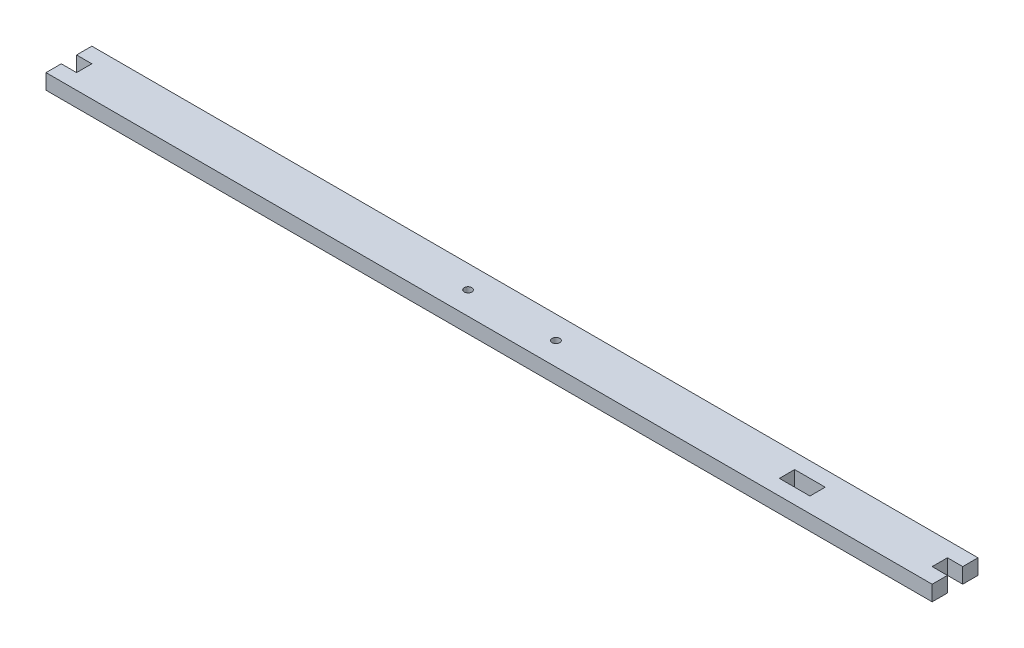
ISO-10303-21;
HEADER;
FILE_DESCRIPTION(('STEP AP214'),'2;1');
FILE_NAME('part.step','',(''),(''),'','','');
FILE_SCHEMA(('AUTOMOTIVE_DESIGN { 1 0 10303 214 1 1 1 1 }'));
ENDSEC;
DATA;
#1=APPLICATION_CONTEXT('core data for automotive mechanical design processes');
#2=APPLICATION_PROTOCOL_DEFINITION('international standard','automotive_design',2000,#1);
#3=PRODUCT_CONTEXT('',#1,'mechanical');
#4=PRODUCT('Part','Part','',(#3));
#5=PRODUCT_RELATED_PRODUCT_CATEGORY('part','',(#4));
#6=PRODUCT_DEFINITION_FORMATION('','',#4);
#7=PRODUCT_DEFINITION_CONTEXT('part definition',#1,'design');
#8=PRODUCT_DEFINITION('design','',#6,#7);
#9=PRODUCT_DEFINITION_SHAPE('','',#8);
#10=(LENGTH_UNIT() NAMED_UNIT(*) SI_UNIT(.MILLI.,.METRE.));
#11=(NAMED_UNIT(*) PLANE_ANGLE_UNIT() SI_UNIT($,.RADIAN.));
#12=(NAMED_UNIT(*) SI_UNIT($,.STERADIAN.) SOLID_ANGLE_UNIT());
#13=UNCERTAINTY_MEASURE_WITH_UNIT(LENGTH_MEASURE(1.E-05),#10,'distance_accuracy_value','');
#14=(GEOMETRIC_REPRESENTATION_CONTEXT(3) GLOBAL_UNCERTAINTY_ASSIGNED_CONTEXT((#13)) GLOBAL_UNIT_ASSIGNED_CONTEXT((#10,
#11,#12)) REPRESENTATION_CONTEXT('',''));
#15=CARTESIAN_POINT('',(0.,0.,0.));
#16=DIRECTION('',(0.,0.,1.));
#17=DIRECTION('',(1.,0.,0.));
#18=AXIS2_PLACEMENT_3D('',#15,#16,#17);
#19=CARTESIAN_POINT('',(0.,6.35,-12.7));
#20=DIRECTION('',(0.,0.,-1.));
#21=DIRECTION('',(-1.,0.,0.));
#22=AXIS2_PLACEMENT_3D('',#19,#20,#21);
#23=PLANE('',#22);
#24=DIRECTION('',(1.,0.,0.));
#25=VECTOR('',#24,1.);
#26=CARTESIAN_POINT('',(0.,0.,-12.7));
#27=LINE('',#26,#25);
#28=CARTESIAN_POINT('',(292.1,0.,-12.7));
#29=VERTEX_POINT('',#28);
#30=CARTESIAN_POINT('',(304.8,0.,-12.7));
#31=VERTEX_POINT('',#30);
#32=EDGE_CURVE('E221',#29,#31,#27,.T.);
#33=ORIENTED_EDGE('',*,*,#32,.T.);
#34=DIRECTION('',(0.,-1.,0.));
#35=VECTOR('',#34,1.);
#36=CARTESIAN_POINT('',(304.8,6.35,-12.7));
#37=LINE('',#36,#35);
#38=CARTESIAN_POINT('',(304.8,6.35,-12.7));
#39=VERTEX_POINT('',#38);
#40=EDGE_CURVE('E11',#39,#31,#37,.T.);
#41=ORIENTED_EDGE('',*,*,#40,.F.);
#42=DIRECTION('',(1.,0.,0.));
#43=VECTOR('',#42,1.);
#44=CARTESIAN_POINT('',(0.,6.35,-12.7));
#45=LINE('',#44,#43);
#46=CARTESIAN_POINT('',(292.1,6.35,-12.7));
#47=VERTEX_POINT('',#46);
#48=EDGE_CURVE('E163',#47,#39,#45,.T.);
#49=ORIENTED_EDGE('',*,*,#48,.F.);
#50=DIRECTION('',(0.,-1.,0.));
#51=VECTOR('',#50,1.);
#52=CARTESIAN_POINT('',(292.1,6.35,-12.7));
#53=LINE('',#52,#51);
#54=EDGE_CURVE('E54',#47,#29,#53,.T.);
#55=ORIENTED_EDGE('',*,*,#54,.T.);
#56=EDGE_LOOP('',(#33,#41,#49,#55));
#57=FACE_BOUND('',#56,.T.);
#58=ADVANCED_FACE('F35',(#57),#23,.F.);
#59=CARTESIAN_POINT('',(304.8,6.35,0.));
#60=DIRECTION('',(1.,0.,0.));
#61=DIRECTION('',(0.,0.,-1.));
#62=AXIS2_PLACEMENT_3D('',#59,#60,#61);
#63=PLANE('',#62);
#64=DIRECTION('',(0.,0.,1.));
#65=VECTOR('',#64,1.);
#66=CARTESIAN_POINT('',(304.8,0.,0.));
#67=LINE('',#66,#65);
#68=CARTESIAN_POINT('',(304.8,0.,-6.35000000000001));
#69=VERTEX_POINT('',#68);
#70=EDGE_CURVE('E169',#31,#69,#67,.T.);
#71=ORIENTED_EDGE('',*,*,#70,.T.);
#72=DIRECTION('',(0.,-1.,0.));
#73=VECTOR('',#72,1.);
#74=CARTESIAN_POINT('',(304.8,6.35,-6.35000000000001));
#75=LINE('',#74,#73);
#76=CARTESIAN_POINT('',(304.8,6.35,-6.35000000000001));
#77=VERTEX_POINT('',#76);
#78=EDGE_CURVE('E45',#77,#69,#75,.T.);
#79=ORIENTED_EDGE('',*,*,#78,.F.);
#80=DIRECTION('',(0.,0.,1.));
#81=VECTOR('',#80,1.);
#82=CARTESIAN_POINT('',(304.8,6.35,0.));
#83=LINE('',#82,#81);
#84=EDGE_CURVE('E157',#39,#77,#83,.T.);
#85=ORIENTED_EDGE('',*,*,#84,.F.);
#86=ORIENTED_EDGE('',*,*,#40,.T.);
#87=EDGE_LOOP('',(#71,#79,#85,#86));
#88=FACE_BOUND('',#87,.T.);
#89=ADVANCED_FACE('F168',(#88),#63,.F.);
#90=CARTESIAN_POINT('',(0.,6.35,-6.34999999999999));
#91=DIRECTION('',(0.,0.,-1.));
#92=DIRECTION('',(-1.,0.,0.));
#93=AXIS2_PLACEMENT_3D('',#90,#91,#92);
#94=PLANE('',#93);
#95=DIRECTION('',(1.,0.,0.));
#96=VECTOR('',#95,1.);
#97=CARTESIAN_POINT('',(0.,0.,-6.34999999999999));
#98=LINE('',#97,#96);
#99=CARTESIAN_POINT('',(292.1,0.,-6.35000000000001));
#100=VERTEX_POINT('',#99);
#101=EDGE_CURVE('E224',#100,#69,#98,.T.);
#102=ORIENTED_EDGE('',*,*,#101,.F.);
#103=DIRECTION('',(0.,-1.,0.));
#104=VECTOR('',#103,1.);
#105=CARTESIAN_POINT('',(292.1,6.35,-6.35000000000001));
#106=LINE('',#105,#104);
#107=CARTESIAN_POINT('',(292.1,6.35,-6.35000000000001));
#108=VERTEX_POINT('',#107);
#109=EDGE_CURVE('E104',#108,#100,#106,.T.);
#110=ORIENTED_EDGE('',*,*,#109,.F.);
#111=DIRECTION('',(1.,0.,0.));
#112=VECTOR('',#111,1.);
#113=CARTESIAN_POINT('',(0.,6.35,-6.34999999999999));
#114=LINE('',#113,#112);
#115=EDGE_CURVE('E162',#108,#77,#114,.T.);
#116=ORIENTED_EDGE('',*,*,#115,.T.);
#117=ORIENTED_EDGE('',*,*,#78,.T.);
#118=EDGE_LOOP('',(#102,#110,#116,#117));
#119=FACE_BOUND('',#118,.T.);
#120=ADVANCED_FACE('F173',(#119),#94,.T.);
#121=CARTESIAN_POINT('',(0.,6.35,0.));
#122=DIRECTION('',(0.,0.,-1.));
#123=DIRECTION('',(-1.,0.,0.));
#124=AXIS2_PLACEMENT_3D('',#121,#122,#123);
#125=PLANE('',#124);
#126=DIRECTION('',(1.,0.,0.));
#127=VECTOR('',#126,1.);
#128=CARTESIAN_POINT('',(0.,0.,0.));
#129=LINE('',#128,#127);
#130=CARTESIAN_POINT('',(-6.35,0.,0.));
#131=VERTEX_POINT('',#130);
#132=CARTESIAN_POINT('',(361.95,0.,0.));
#133=VERTEX_POINT('',#132);
#134=EDGE_CURVE('E186',#131,#133,#129,.T.);
#135=ORIENTED_EDGE('',*,*,#134,.T.);
#136=DIRECTION('',(0.,-1.,0.));
#137=VECTOR('',#136,1.);
#138=CARTESIAN_POINT('',(361.95,6.35,0.));
#139=LINE('',#138,#137);
#140=CARTESIAN_POINT('',(361.95,6.35,0.));
#141=VERTEX_POINT('',#140);
#142=EDGE_CURVE('E39',#141,#133,#139,.T.);
#143=ORIENTED_EDGE('',*,*,#142,.F.);
#144=DIRECTION('',(1.,0.,0.));
#145=VECTOR('',#144,1.);
#146=CARTESIAN_POINT('',(0.,6.35,0.));
#147=LINE('',#146,#145);
#148=CARTESIAN_POINT('',(-6.35,6.35,0.));
#149=VERTEX_POINT('',#148);
#150=EDGE_CURVE('E319',#149,#141,#147,.T.);
#151=ORIENTED_EDGE('',*,*,#150,.F.);
#152=DIRECTION('',(0.,-1.,0.));
#153=VECTOR('',#152,1.);
#154=CARTESIAN_POINT('',(-6.35,6.35,0.));
#155=LINE('',#154,#153);
#156=EDGE_CURVE('E176',#149,#131,#155,.T.);
#157=ORIENTED_EDGE('',*,*,#156,.T.);
#158=EDGE_LOOP('',(#135,#143,#151,#157));
#159=FACE_BOUND('',#158,.T.);
#160=ADVANCED_FACE('F260',(#159),#125,.F.);
#161=CARTESIAN_POINT('',(361.95,6.35,0.));
#162=DIRECTION('',(-1.,0.,0.));
#163=DIRECTION('',(0.,0.,1.));
#164=AXIS2_PLACEMENT_3D('',#161,#162,#163);
#165=PLANE('',#164);
#166=DIRECTION('',(0.,0.,-1.));
#167=VECTOR('',#166,1.);
#168=CARTESIAN_POINT('',(361.95,0.,0.));
#169=LINE('',#168,#167);
#170=CARTESIAN_POINT('',(361.95,0.,-6.35000000000001));
#171=VERTEX_POINT('',#170);
#172=EDGE_CURVE('E189',#133,#171,#169,.T.);
#173=ORIENTED_EDGE('',*,*,#172,.T.);
#174=DIRECTION('',(0.,-1.,0.));
#175=VECTOR('',#174,1.);
#176=CARTESIAN_POINT('',(361.95,6.35,-6.35000000000001));
#177=LINE('',#176,#175);
#178=CARTESIAN_POINT('',(361.95,6.35,-6.35000000000001));
#179=VERTEX_POINT('',#178);
#180=EDGE_CURVE('E251',#179,#171,#177,.T.);
#181=ORIENTED_EDGE('',*,*,#180,.F.);
#182=DIRECTION('',(0.,0.,-1.));
#183=VECTOR('',#182,1.);
#184=CARTESIAN_POINT('',(361.95,6.35,0.));
#185=LINE('',#184,#183);
#186=EDGE_CURVE('E117',#141,#179,#185,.T.);
#187=ORIENTED_EDGE('',*,*,#186,.F.);
#188=ORIENTED_EDGE('',*,*,#142,.T.);
#189=EDGE_LOOP('',(#173,#181,#187,#188));
#190=FACE_BOUND('',#189,.T.);
#191=ADVANCED_FACE('F256',(#190),#165,.F.);
#192=CARTESIAN_POINT('',(0.,6.35,-6.35000000000006));
#193=DIRECTION('',(0.,0.,-1.));
#194=DIRECTION('',(-1.,0.,0.));
#195=AXIS2_PLACEMENT_3D('',#192,#193,#194);
#196=PLANE('',#195);
#197=DIRECTION('',(1.,0.,0.));
#198=VECTOR('',#197,1.);
#199=CARTESIAN_POINT('',(0.,0.,-6.35000000000006));
#200=LINE('',#199,#198);
#201=CARTESIAN_POINT('',(355.6,0.,-6.35000000000001));
#202=VERTEX_POINT('',#201);
#203=EDGE_CURVE('E192',#202,#171,#200,.T.);
#204=ORIENTED_EDGE('',*,*,#203,.F.);
#205=DIRECTION('',(0.,-1.,0.));
#206=VECTOR('',#205,1.);
#207=CARTESIAN_POINT('',(355.6,6.35,-6.35000000000001));
#208=LINE('',#207,#206);
#209=CARTESIAN_POINT('',(355.6,6.35,-6.35000000000001));
#210=VERTEX_POINT('',#209);
#211=EDGE_CURVE('E250',#210,#202,#208,.T.);
#212=ORIENTED_EDGE('',*,*,#211,.F.);
#213=DIRECTION('',(1.,0.,0.));
#214=VECTOR('',#213,1.);
#215=CARTESIAN_POINT('',(0.,6.35,-6.35000000000006));
#216=LINE('',#215,#214);
#217=EDGE_CURVE('E315',#210,#179,#216,.T.);
#218=ORIENTED_EDGE('',*,*,#217,.T.);
#219=ORIENTED_EDGE('',*,*,#180,.T.);
#220=EDGE_LOOP('',(#204,#212,#218,#219));
#221=FACE_BOUND('',#220,.T.);
#222=ADVANCED_FACE('F314',(#221),#196,.T.);
#223=CARTESIAN_POINT('',(355.6,6.35,0.));
#224=DIRECTION('',(-1.,0.,0.));
#225=DIRECTION('',(0.,0.,1.));
#226=AXIS2_PLACEMENT_3D('',#223,#224,#225);
#227=PLANE('',#226);
#228=DIRECTION('',(0.,0.,-1.));
#229=VECTOR('',#228,1.);
#230=CARTESIAN_POINT('',(355.6,0.,0.));
#231=LINE('',#230,#229);
#232=CARTESIAN_POINT('',(355.6,0.,-12.7));
#233=VERTEX_POINT('',#232);
#234=EDGE_CURVE('E195',#202,#233,#231,.T.);
#235=ORIENTED_EDGE('',*,*,#234,.T.);
#236=DIRECTION('',(0.,-1.,0.));
#237=VECTOR('',#236,1.);
#238=CARTESIAN_POINT('',(355.6,6.35,-12.7));
#239=LINE('',#238,#237);
#240=CARTESIAN_POINT('',(355.6,6.35,-12.7));
#241=VERTEX_POINT('',#240);
#242=EDGE_CURVE('E247',#241,#233,#239,.T.);
#243=ORIENTED_EDGE('',*,*,#242,.F.);
#244=DIRECTION('',(0.,0.,-1.));
#245=VECTOR('',#244,1.);
#246=CARTESIAN_POINT('',(355.6,6.35,0.));
#247=LINE('',#246,#245);
#248=EDGE_CURVE('E312',#210,#241,#247,.T.);
#249=ORIENTED_EDGE('',*,*,#248,.F.);
#250=ORIENTED_EDGE('',*,*,#211,.T.);
#251=EDGE_LOOP('',(#235,#243,#249,#250));
#252=FACE_BOUND('',#251,.T.);
#253=ADVANCED_FACE('F311',(#252),#227,.F.);
#254=CARTESIAN_POINT('',(0.,6.35,-12.7));
#255=DIRECTION('',(0.,0.,-1.));
#256=DIRECTION('',(-1.,0.,0.));
#257=AXIS2_PLACEMENT_3D('',#254,#255,#256);
#258=PLANE('',#257);
#259=DIRECTION('',(1.,0.,0.));
#260=VECTOR('',#259,1.);
#261=CARTESIAN_POINT('',(0.,0.,-12.7));
#262=LINE('',#261,#260);
#263=CARTESIAN_POINT('',(361.95,0.,-12.7));
#264=VERTEX_POINT('',#263);
#265=EDGE_CURVE('E197',#233,#264,#262,.T.);
#266=ORIENTED_EDGE('',*,*,#265,.T.);
#267=DIRECTION('',(0.,-1.,0.));
#268=VECTOR('',#267,1.);
#269=CARTESIAN_POINT('',(361.95,6.35,-12.7));
#270=LINE('',#269,#268);
#271=CARTESIAN_POINT('',(361.95,6.35,-12.7));
#272=VERTEX_POINT('',#271);
#273=EDGE_CURVE('E245',#272,#264,#270,.T.);
#274=ORIENTED_EDGE('',*,*,#273,.F.);
#275=DIRECTION('',(1.,0.,0.));
#276=VECTOR('',#275,1.);
#277=CARTESIAN_POINT('',(0.,6.35,-12.7));
#278=LINE('',#277,#276);
#279=EDGE_CURVE('E308',#241,#272,#278,.T.);
#280=ORIENTED_EDGE('',*,*,#279,.F.);
#281=ORIENTED_EDGE('',*,*,#242,.T.);
#282=EDGE_LOOP('',(#266,#274,#280,#281));
#283=FACE_BOUND('',#282,.T.);
#284=ADVANCED_FACE('F305',(#283),#258,.F.);
#285=CARTESIAN_POINT('',(361.95,6.35,0.));
#286=DIRECTION('',(1.,0.,0.));
#287=DIRECTION('',(0.,0.,-1.));
#288=AXIS2_PLACEMENT_3D('',#285,#286,#287);
#289=PLANE('',#288);
#290=DIRECTION('',(0.,0.,1.));
#291=VECTOR('',#290,1.);
#292=CARTESIAN_POINT('',(361.95,0.,0.));
#293=LINE('',#292,#291);
#294=CARTESIAN_POINT('',(361.95,0.,-19.05));
#295=VERTEX_POINT('',#294);
#296=EDGE_CURVE('E200',#295,#264,#293,.T.);
#297=ORIENTED_EDGE('',*,*,#296,.F.);
#298=DIRECTION('',(0.,-1.,0.));
#299=VECTOR('',#298,1.);
#300=CARTESIAN_POINT('',(361.95,6.35,-19.05));
#301=LINE('',#300,#299);
#302=CARTESIAN_POINT('',(361.95,6.35,-19.05));
#303=VERTEX_POINT('',#302);
#304=EDGE_CURVE('E243',#303,#295,#301,.T.);
#305=ORIENTED_EDGE('',*,*,#304,.F.);
#306=DIRECTION('',(0.,0.,1.));
#307=VECTOR('',#306,1.);
#308=CARTESIAN_POINT('',(361.95,6.35,0.));
#309=LINE('',#308,#307);
#310=EDGE_CURVE('E324',#303,#272,#309,.T.);
#311=ORIENTED_EDGE('',*,*,#310,.T.);
#312=ORIENTED_EDGE('',*,*,#273,.T.);
#313=EDGE_LOOP('',(#297,#305,#311,#312));
#314=FACE_BOUND('',#313,.T.);
#315=ADVANCED_FACE('F300',(#314),#289,.T.);
#316=CARTESIAN_POINT('',(0.,6.35,-19.05));
#317=DIRECTION('',(0.,0.,-1.));
#318=DIRECTION('',(-1.,0.,0.));
#319=AXIS2_PLACEMENT_3D('',#316,#317,#318);
#320=PLANE('',#319);
#321=DIRECTION('',(1.,0.,0.));
#322=VECTOR('',#321,1.);
#323=CARTESIAN_POINT('',(0.,0.,-19.05));
#324=LINE('',#323,#322);
#325=CARTESIAN_POINT('',(-6.35,0.,-19.05));
#326=VERTEX_POINT('',#325);
#327=EDGE_CURVE('E203',#326,#295,#324,.T.);
#328=ORIENTED_EDGE('',*,*,#327,.F.);
#329=DIRECTION('',(0.,-1.,0.));
#330=VECTOR('',#329,1.);
#331=CARTESIAN_POINT('',(-6.35,6.35,-19.05));
#332=LINE('',#331,#330);
#333=CARTESIAN_POINT('',(-6.35,6.35,-19.05));
#334=VERTEX_POINT('',#333);
#335=EDGE_CURVE('E241',#334,#326,#332,.T.);
#336=ORIENTED_EDGE('',*,*,#335,.F.);
#337=DIRECTION('',(1.,0.,0.));
#338=VECTOR('',#337,1.);
#339=CARTESIAN_POINT('',(0.,6.35,-19.05));
#340=LINE('',#339,#338);
#341=EDGE_CURVE('E296',#334,#303,#340,.T.);
#342=ORIENTED_EDGE('',*,*,#341,.T.);
#343=ORIENTED_EDGE('',*,*,#304,.T.);
#344=EDGE_LOOP('',(#328,#336,#342,#343));
#345=FACE_BOUND('',#344,.T.);
#346=ADVANCED_FACE('F291',(#345),#320,.T.);
#347=CARTESIAN_POINT('',(-6.34999999999999,6.35,0.));
#348=DIRECTION('',(1.,0.,0.));
#349=DIRECTION('',(0.,0.,-1.));
#350=AXIS2_PLACEMENT_3D('',#347,#348,#349);
#351=PLANE('',#350);
#352=DIRECTION('',(0.,0.,1.));
#353=VECTOR('',#352,1.);
#354=CARTESIAN_POINT('',(-6.34999999999999,0.,0.));
#355=LINE('',#354,#353);
#356=CARTESIAN_POINT('',(-6.35,0.,-12.7));
#357=VERTEX_POINT('',#356);
#358=EDGE_CURVE('E206',#326,#357,#355,.T.);
#359=ORIENTED_EDGE('',*,*,#358,.T.);
#360=DIRECTION('',(0.,-1.,0.));
#361=VECTOR('',#360,1.);
#362=CARTESIAN_POINT('',(-6.35,6.35,-12.7));
#363=LINE('',#362,#361);
#364=CARTESIAN_POINT('',(-6.35,6.35,-12.7));
#365=VERTEX_POINT('',#364);
#366=EDGE_CURVE('E239',#365,#357,#363,.T.);
#367=ORIENTED_EDGE('',*,*,#366,.F.);
#368=DIRECTION('',(0.,0.,1.));
#369=VECTOR('',#368,1.);
#370=CARTESIAN_POINT('',(-6.34999999999999,6.35,0.));
#371=LINE('',#370,#369);
#372=EDGE_CURVE('E327',#334,#365,#371,.T.);
#373=ORIENTED_EDGE('',*,*,#372,.F.);
#374=ORIENTED_EDGE('',*,*,#335,.T.);
#375=EDGE_LOOP('',(#359,#367,#373,#374));
#376=FACE_BOUND('',#375,.T.);
#377=ADVANCED_FACE('F334',(#376),#351,.F.);
#378=CARTESIAN_POINT('',(0.,6.35,-12.7));
#379=DIRECTION('',(0.,0.,1.));
#380=DIRECTION('',(1.,0.,0.));
#381=AXIS2_PLACEMENT_3D('',#378,#379,#380);
#382=PLANE('',#381);
#383=DIRECTION('',(-1.,0.,0.));
#384=VECTOR('',#383,1.);
#385=CARTESIAN_POINT('',(0.,0.,-12.7));
#386=LINE('',#385,#384);
#387=CARTESIAN_POINT('',(0.,0.,-12.7));
#388=VERTEX_POINT('',#387);
#389=EDGE_CURVE('E209',#388,#357,#386,.T.);
#390=ORIENTED_EDGE('',*,*,#389,.F.);
#391=DIRECTION('',(0.,-1.,0.));
#392=VECTOR('',#391,1.);
#393=CARTESIAN_POINT('',(0.,6.35,-12.7));
#394=LINE('',#393,#392);
#395=CARTESIAN_POINT('',(0.,6.35,-12.7));
#396=VERTEX_POINT('',#395);
#397=EDGE_CURVE('E237',#396,#388,#394,.T.);
#398=ORIENTED_EDGE('',*,*,#397,.F.);
#399=DIRECTION('',(-1.,0.,0.));
#400=VECTOR('',#399,1.);
#401=CARTESIAN_POINT('',(0.,6.35,-12.7));
#402=LINE('',#401,#400);
#403=EDGE_CURVE('E329',#396,#365,#402,.T.);
#404=ORIENTED_EDGE('',*,*,#403,.T.);
#405=ORIENTED_EDGE('',*,*,#366,.T.);
#406=EDGE_LOOP('',(#390,#398,#404,#405));
#407=FACE_BOUND('',#406,.T.);
#408=ADVANCED_FACE('F285',(#407),#382,.T.);
#409=CARTESIAN_POINT('',(0.,6.35,0.));
#410=DIRECTION('',(-1.,0.,0.));
#411=DIRECTION('',(0.,0.,1.));
#412=AXIS2_PLACEMENT_3D('',#409,#410,#411);
#413=PLANE('',#412);
#414=DIRECTION('',(0.,0.,-1.));
#415=VECTOR('',#414,1.);
#416=CARTESIAN_POINT('',(0.,0.,0.));
#417=LINE('',#416,#415);
#418=CARTESIAN_POINT('',(0.,0.,-6.35));
#419=VERTEX_POINT('',#418);
#420=EDGE_CURVE('E212',#419,#388,#417,.T.);
#421=ORIENTED_EDGE('',*,*,#420,.F.);
#422=DIRECTION('',(0.,-1.,0.));
#423=VECTOR('',#422,1.);
#424=CARTESIAN_POINT('',(0.,6.35,-6.35));
#425=LINE('',#424,#423);
#426=CARTESIAN_POINT('',(0.,6.35,-6.35));
#427=VERTEX_POINT('',#426);
#428=EDGE_CURVE('E235',#427,#419,#425,.T.);
#429=ORIENTED_EDGE('',*,*,#428,.F.);
#430=DIRECTION('',(0.,0.,-1.));
#431=VECTOR('',#430,1.);
#432=CARTESIAN_POINT('',(0.,6.35,0.));
#433=LINE('',#432,#431);
#434=EDGE_CURVE('E281',#427,#396,#433,.T.);
#435=ORIENTED_EDGE('',*,*,#434,.T.);
#436=ORIENTED_EDGE('',*,*,#397,.T.);
#437=EDGE_LOOP('',(#421,#429,#435,#436));
#438=FACE_BOUND('',#437,.T.);
#439=ADVANCED_FACE('F277',(#438),#413,.T.);
#440=CARTESIAN_POINT('',(0.,6.35,-6.35));
#441=DIRECTION('',(0.,0.,1.));
#442=DIRECTION('',(1.,0.,0.));
#443=AXIS2_PLACEMENT_3D('',#440,#441,#442);
#444=PLANE('',#443);
#445=DIRECTION('',(-1.,0.,0.));
#446=VECTOR('',#445,1.);
#447=CARTESIAN_POINT('',(0.,0.,-6.35));
#448=LINE('',#447,#446);
#449=CARTESIAN_POINT('',(-6.35,0.,-6.35));
#450=VERTEX_POINT('',#449);
#451=EDGE_CURVE('E215',#419,#450,#448,.T.);
#452=ORIENTED_EDGE('',*,*,#451,.T.);
#453=DIRECTION('',(0.,-1.,0.));
#454=VECTOR('',#453,1.);
#455=CARTESIAN_POINT('',(-6.35,6.35,-6.35));
#456=LINE('',#455,#454);
#457=CARTESIAN_POINT('',(-6.35,6.35,-6.35));
#458=VERTEX_POINT('',#457);
#459=EDGE_CURVE('E233',#458,#450,#456,.T.);
#460=ORIENTED_EDGE('',*,*,#459,.F.);
#461=DIRECTION('',(-1.,0.,0.));
#462=VECTOR('',#461,1.);
#463=CARTESIAN_POINT('',(0.,6.35,-6.35));
#464=LINE('',#463,#462);
#465=EDGE_CURVE('E332',#427,#458,#464,.T.);
#466=ORIENTED_EDGE('',*,*,#465,.F.);
#467=ORIENTED_EDGE('',*,*,#428,.T.);
#468=EDGE_LOOP('',(#452,#460,#466,#467));
#469=FACE_BOUND('',#468,.T.);
#470=ADVANCED_FACE('F274',(#469),#444,.F.);
#471=CARTESIAN_POINT('',(-6.35,6.35,0.));
#472=DIRECTION('',(-1.,0.,0.));
#473=DIRECTION('',(0.,0.,1.));
#474=AXIS2_PLACEMENT_3D('',#471,#472,#473);
#475=PLANE('',#474);
#476=DIRECTION('',(0.,0.,-1.));
#477=VECTOR('',#476,1.);
#478=CARTESIAN_POINT('',(-6.35,0.,0.));
#479=LINE('',#478,#477);
#480=EDGE_CURVE('E218',#131,#450,#479,.T.);
#481=ORIENTED_EDGE('',*,*,#480,.F.);
#482=ORIENTED_EDGE('',*,*,#156,.F.);
#483=DIRECTION('',(0.,0.,-1.));
#484=VECTOR('',#483,1.);
#485=CARTESIAN_POINT('',(-6.35,6.35,0.));
#486=LINE('',#485,#484);
#487=EDGE_CURVE('E271',#149,#458,#486,.T.);
#488=ORIENTED_EDGE('',*,*,#487,.T.);
#489=ORIENTED_EDGE('',*,*,#459,.T.);
#490=EDGE_LOOP('',(#481,#482,#488,#489));
#491=FACE_BOUND('',#490,.T.);
#492=ADVANCED_FACE('F267',(#491),#475,.T.);
#493=CARTESIAN_POINT('',(159.54375,6.35,-9.525));
#494=DIRECTION('',(0.,-1.,0.));
#495=DIRECTION('',(0.,0.,-1.));
#496=AXIS2_PLACEMENT_3D('',#493,#494,#495);
#497=CYLINDRICAL_SURFACE('',#496,1.58749999999998);
#498=CARTESIAN_POINT('',(159.54375,6.35,-9.525));
#499=DIRECTION('',(0.,1.,0.));
#500=DIRECTION('',(0.,0.,1.));
#501=AXIS2_PLACEMENT_3D('',#498,#499,#500);
#502=CIRCLE('',#501,1.58749999999998);
#503=CARTESIAN_POINT('',(159.54375,6.35,-7.93750000000002));
#504=VERTEX_POINT('',#503);
#505=EDGE_CURVE('E563',#504,#504,#502,.T.);
#506=ORIENTED_EDGE('',*,*,#505,.T.);
#507=EDGE_LOOP('',(#506));
#508=FACE_BOUND('',#507,.T.);
#509=CARTESIAN_POINT('',(159.54375,0.,-9.525));
#510=DIRECTION('',(0.,1.,0.));
#511=DIRECTION('',(0.,0.,1.));
#512=AXIS2_PLACEMENT_3D('',#509,#510,#511);
#513=CIRCLE('',#512,1.58749999999998);
#514=CARTESIAN_POINT('',(159.54375,0.,-7.93750000000002));
#515=VERTEX_POINT('',#514);
#516=EDGE_CURVE('E183',#515,#515,#513,.T.);
#517=ORIENTED_EDGE('',*,*,#516,.F.);
#518=EDGE_LOOP('',(#517));
#519=FACE_BOUND('',#518,.T.);
#520=ADVANCED_FACE('F353',(#508,#519),#497,.F.);
#521=CARTESIAN_POINT('',(196.05625,6.35,-9.525));
#522=DIRECTION('',(0.,-1.,0.));
#523=DIRECTION('',(0.,0.,-1.));
#524=AXIS2_PLACEMENT_3D('',#521,#522,#523);
#525=CYLINDRICAL_SURFACE('',#524,1.58749999999998);
#526=CARTESIAN_POINT('',(196.05625,6.35,-9.525));
#527=DIRECTION('',(0.,1.,0.));
#528=DIRECTION('',(0.,0.,1.));
#529=AXIS2_PLACEMENT_3D('',#526,#527,#528);
#530=CIRCLE('',#529,1.58749999999998);
#531=CARTESIAN_POINT('',(196.05625,6.35,-7.93750000000002));
#532=VERTEX_POINT('',#531);
#533=EDGE_CURVE('E229',#532,#532,#530,.T.);
#534=ORIENTED_EDGE('',*,*,#533,.T.);
#535=EDGE_LOOP('',(#534));
#536=FACE_BOUND('',#535,.T.);
#537=CARTESIAN_POINT('',(196.05625,0.,-9.525));
#538=DIRECTION('',(0.,1.,0.));
#539=DIRECTION('',(0.,0.,1.));
#540=AXIS2_PLACEMENT_3D('',#537,#538,#539);
#541=CIRCLE('',#540,1.58749999999998);
#542=CARTESIAN_POINT('',(196.05625,0.,-7.93750000000002));
#543=VERTEX_POINT('',#542);
#544=EDGE_CURVE('E180',#543,#543,#541,.T.);
#545=ORIENTED_EDGE('',*,*,#544,.F.);
#546=EDGE_LOOP('',(#545));
#547=FACE_BOUND('',#546,.T.);
#548=ADVANCED_FACE('F37',(#536,#547),#525,.F.);
#549=CARTESIAN_POINT('',(292.1,6.35,0.));
#550=DIRECTION('',(1.,0.,0.));
#551=DIRECTION('',(0.,0.,-1.));
#552=AXIS2_PLACEMENT_3D('',#549,#550,#551);
#553=PLANE('',#552);
#554=DIRECTION('',(0.,0.,1.));
#555=VECTOR('',#554,1.);
#556=CARTESIAN_POINT('',(292.1,0.,0.));
#557=LINE('',#556,#555);
#558=EDGE_CURVE('E226',#29,#100,#557,.T.);
#559=ORIENTED_EDGE('',*,*,#558,.F.);
#560=ORIENTED_EDGE('',*,*,#54,.F.);
#561=DIRECTION('',(0.,0.,1.));
#562=VECTOR('',#561,1.);
#563=CARTESIAN_POINT('',(292.1,6.35,0.));
#564=LINE('',#563,#562);
#565=EDGE_CURVE('E174',#47,#108,#564,.T.);
#566=ORIENTED_EDGE('',*,*,#565,.T.);
#567=ORIENTED_EDGE('',*,*,#109,.T.);
#568=EDGE_LOOP('',(#559,#560,#566,#567));
#569=FACE_BOUND('',#568,.T.);
#570=ADVANCED_FACE('F381',(#569),#553,.T.);
#571=CARTESIAN_POINT('',(0.,6.35,0.));
#572=DIRECTION('',(0.,1.,0.));
#573=DIRECTION('',(0.,0.,1.));
#574=AXIS2_PLACEMENT_3D('',#571,#572,#573);
#575=PLANE('',#574);
#576=ORIENTED_EDGE('',*,*,#533,.F.);
#577=EDGE_LOOP('',(#576));
#578=FACE_BOUND('',#577,.T.);
#579=ORIENTED_EDGE('',*,*,#505,.F.);
#580=EDGE_LOOP('',(#579));
#581=FACE_BOUND('',#580,.T.);
#582=ORIENTED_EDGE('',*,*,#150,.T.);
#583=ORIENTED_EDGE('',*,*,#186,.T.);
#584=ORIENTED_EDGE('',*,*,#217,.F.);
#585=ORIENTED_EDGE('',*,*,#248,.T.);
#586=ORIENTED_EDGE('',*,*,#279,.T.);
#587=ORIENTED_EDGE('',*,*,#310,.F.);
#588=ORIENTED_EDGE('',*,*,#341,.F.);
#589=ORIENTED_EDGE('',*,*,#372,.T.);
#590=ORIENTED_EDGE('',*,*,#403,.F.);
#591=ORIENTED_EDGE('',*,*,#434,.F.);
#592=ORIENTED_EDGE('',*,*,#465,.T.);
#593=ORIENTED_EDGE('',*,*,#487,.F.);
#594=EDGE_LOOP('',(#582,#583,#584,#585,#586,#587,#588,#589,#590,#591,#592,#593));
#595=FACE_BOUND('',#594,.T.);
#596=ORIENTED_EDGE('',*,*,#48,.T.);
#597=ORIENTED_EDGE('',*,*,#84,.T.);
#598=ORIENTED_EDGE('',*,*,#115,.F.);
#599=ORIENTED_EDGE('',*,*,#565,.F.);
#600=EDGE_LOOP('',(#596,#597,#598,#599));
#601=FACE_BOUND('',#600,.T.);
#602=ADVANCED_FACE('F159',(#578,#581,#595,#601),#575,.T.);
#603=CARTESIAN_POINT('',(0.,0.,0.));
#604=DIRECTION('',(0.,1.,0.));
#605=DIRECTION('',(0.,0.,1.));
#606=AXIS2_PLACEMENT_3D('',#603,#604,#605);
#607=PLANE('',#606);
#608=ORIENTED_EDGE('',*,*,#544,.T.);
#609=EDGE_LOOP('',(#608));
#610=FACE_BOUND('',#609,.T.);
#611=ORIENTED_EDGE('',*,*,#516,.T.);
#612=EDGE_LOOP('',(#611));
#613=FACE_BOUND('',#612,.T.);
#614=ORIENTED_EDGE('',*,*,#134,.F.);
#615=ORIENTED_EDGE('',*,*,#480,.T.);
#616=ORIENTED_EDGE('',*,*,#451,.F.);
#617=ORIENTED_EDGE('',*,*,#420,.T.);
#618=ORIENTED_EDGE('',*,*,#389,.T.);
#619=ORIENTED_EDGE('',*,*,#358,.F.);
#620=ORIENTED_EDGE('',*,*,#327,.T.);
#621=ORIENTED_EDGE('',*,*,#296,.T.);
#622=ORIENTED_EDGE('',*,*,#265,.F.);
#623=ORIENTED_EDGE('',*,*,#234,.F.);
#624=ORIENTED_EDGE('',*,*,#203,.T.);
#625=ORIENTED_EDGE('',*,*,#172,.F.);
#626=EDGE_LOOP('',(#614,#615,#616,#617,#618,#619,#620,#621,#622,#623,#624,#625));
#627=FACE_BOUND('',#626,.T.);
#628=ORIENTED_EDGE('',*,*,#32,.F.);
#629=ORIENTED_EDGE('',*,*,#558,.T.);
#630=ORIENTED_EDGE('',*,*,#101,.T.);
#631=ORIENTED_EDGE('',*,*,#70,.F.);
#632=EDGE_LOOP('',(#628,#629,#630,#631));
#633=FACE_BOUND('',#632,.T.);
#634=ADVANCED_FACE('F263',(#610,#613,#627,#633),#607,.F.);
#635=CLOSED_SHELL('',(#58,#89,#120,#160,#191,#222,#253,#284,#315,#346,#377,#408,#439,#470,#492,
#520,#548,#570,#602,#634));
#636=MANIFOLD_SOLID_BREP('B2',#635);
#637=ADVANCED_BREP_SHAPE_REPRESENTATION('',(#18,#636),#14);
#638=SHAPE_DEFINITION_REPRESENTATION(#9,#637);
ENDSEC;
END-ISO-10303-21;
